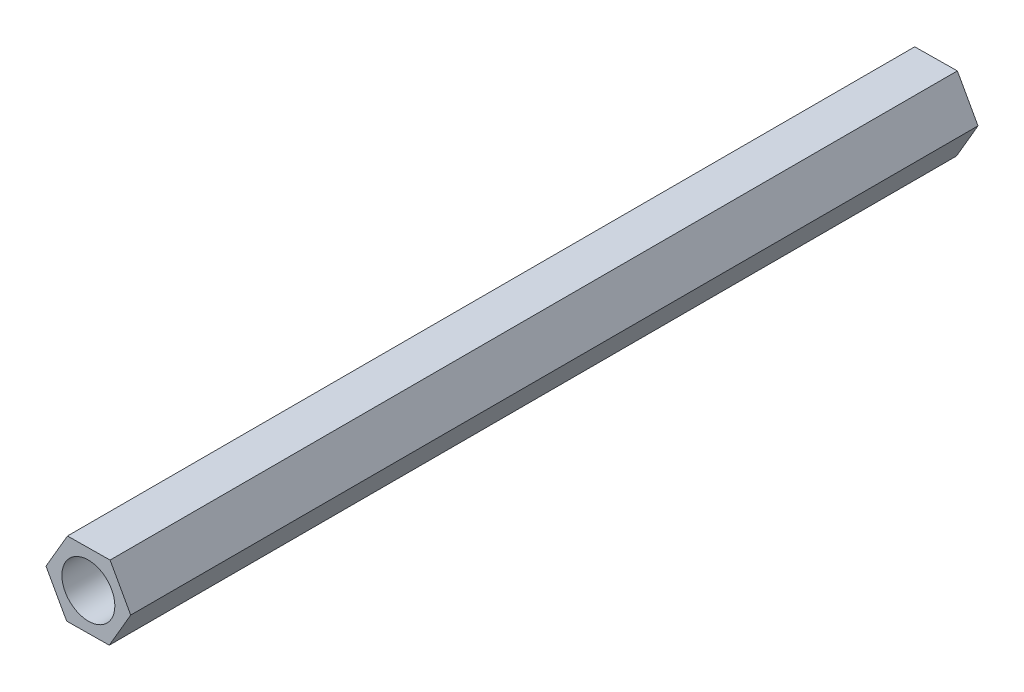
ISO-10303-21;
HEADER;
FILE_DESCRIPTION(('STEP AP214'),'2;1');
FILE_NAME('part.step','',(''),(''),'','','');
FILE_SCHEMA(('AUTOMOTIVE_DESIGN { 1 0 10303 214 1 1 1 1 }'));
ENDSEC;
DATA;
#1=APPLICATION_CONTEXT('core data for automotive mechanical design processes');
#2=APPLICATION_PROTOCOL_DEFINITION('international standard','automotive_design',2000,#1);
#3=PRODUCT_CONTEXT('',#1,'mechanical');
#4=PRODUCT('Part','Part','',(#3));
#5=PRODUCT_RELATED_PRODUCT_CATEGORY('part','',(#4));
#6=PRODUCT_DEFINITION_FORMATION('','',#4);
#7=PRODUCT_DEFINITION_CONTEXT('part definition',#1,'design');
#8=PRODUCT_DEFINITION('design','',#6,#7);
#9=PRODUCT_DEFINITION_SHAPE('','',#8);
#10=(LENGTH_UNIT() NAMED_UNIT(*) SI_UNIT(.MILLI.,.METRE.));
#11=(NAMED_UNIT(*) PLANE_ANGLE_UNIT() SI_UNIT($,.RADIAN.));
#12=(NAMED_UNIT(*) SI_UNIT($,.STERADIAN.) SOLID_ANGLE_UNIT());
#13=UNCERTAINTY_MEASURE_WITH_UNIT(LENGTH_MEASURE(1.E-05),#10,'distance_accuracy_value','');
#14=(GEOMETRIC_REPRESENTATION_CONTEXT(3) GLOBAL_UNCERTAINTY_ASSIGNED_CONTEXT((#13)) GLOBAL_UNIT_ASSIGNED_CONTEXT((#10,
#11,#12)) REPRESENTATION_CONTEXT('',''));
#15=CARTESIAN_POINT('',(0.,0.,0.));
#16=DIRECTION('',(0.,0.,1.));
#17=DIRECTION('',(1.,0.,0.));
#18=AXIS2_PLACEMENT_3D('',#15,#16,#17);
#19=CARTESIAN_POINT('',(0.,0.,80.));
#20=DIRECTION('',(0.,0.,-1.));
#21=DIRECTION('',(-1.,0.,0.));
#22=AXIS2_PLACEMENT_3D('',#19,#20,#21);
#23=PLANE('',#22);
#24=DIRECTION('',(-0.503203464957321,-0.864167965649587,0.));
#25=VECTOR('',#24,1.);
#26=CARTESIAN_POINT('',(-4.,0.,80.));
#27=LINE('',#26,#25);
#28=CARTESIAN_POINT('',(-1.97429018283957,3.47881851695993,80.));
#29=VERTEX_POINT('',#28);
#30=CARTESIAN_POINT('',(-4.,0.,80.));
#31=VERTEX_POINT('',#30);
#32=EDGE_CURVE('E146',#29,#31,#27,.T.);
#33=ORIENTED_EDGE('',*,*,#32,.T.);
#34=DIRECTION('',(0.484122918275927,-0.875,0.));
#35=VECTOR('',#34,1.);
#36=CARTESIAN_POINT('',(-2.05110136046643,-3.52242425470125,80.));
#37=LINE('',#36,#35);
#38=CARTESIAN_POINT('',(-2.05110136046643,-3.52242425470125,80.));
#39=VERTEX_POINT('',#38);
#40=EDGE_CURVE('E94',#31,#39,#37,.T.);
#41=ORIENTED_EDGE('',*,*,#40,.T.);
#42=DIRECTION('',(0.999941331794937,0.0108320343504131,0.));
#43=VECTOR('',#42,1.);
#44=CARTESIAN_POINT('',(1.97429018283957,-3.47881851695993,80.));
#45=LINE('',#44,#43);
#46=CARTESIAN_POINT('',(1.97429018283957,-3.47881851695993,80.));
#47=VERTEX_POINT('',#46);
#48=EDGE_CURVE('E107',#39,#47,#45,.T.);
#49=ORIENTED_EDGE('',*,*,#48,.T.);
#50=DIRECTION('',(0.503203464957321,0.864167965649587,0.));
#51=VECTOR('',#50,1.);
#52=CARTESIAN_POINT('',(4.,0.,80.));
#53=LINE('',#52,#51);
#54=CARTESIAN_POINT('',(4.,0.,80.));
#55=VERTEX_POINT('',#54);
#56=EDGE_CURVE('E101',#47,#55,#53,.T.);
#57=ORIENTED_EDGE('',*,*,#56,.T.);
#58=DIRECTION('',(-0.484122918275927,0.875,0.));
#59=VECTOR('',#58,1.);
#60=CARTESIAN_POINT('',(2.05110136046643,3.52242425470125,80.));
#61=LINE('',#60,#59);
#62=CARTESIAN_POINT('',(2.05110136046643,3.52242425470125,80.));
#63=VERTEX_POINT('',#62);
#64=EDGE_CURVE('E105',#55,#63,#61,.T.);
#65=ORIENTED_EDGE('',*,*,#64,.T.);
#66=DIRECTION('',(-0.999941331794937,-0.0108320343504131,0.));
#67=VECTOR('',#66,1.);
#68=CARTESIAN_POINT('',(-1.97429018283957,3.47881851695993,80.));
#69=LINE('',#68,#67);
#70=EDGE_CURVE('E57',#63,#29,#69,.T.);
#71=ORIENTED_EDGE('',*,*,#70,.T.);
#72=EDGE_LOOP('',(#33,#41,#49,#57,#65,#71));
#73=FACE_BOUND('',#72,.T.);
#74=CARTESIAN_POINT('',(0.,0.,80.));
#75=DIRECTION('',(0.,0.,1.));
#76=DIRECTION('',(1.,0.,0.));
#77=AXIS2_PLACEMENT_3D('',#74,#75,#76);
#78=CIRCLE('',#77,2.5);
#79=CARTESIAN_POINT('',(2.5,0.,80.));
#80=VERTEX_POINT('',#79);
#81=EDGE_CURVE('E134',#80,#80,#78,.T.);
#82=ORIENTED_EDGE('',*,*,#81,.F.);
#83=EDGE_LOOP('',(#82));
#84=FACE_BOUND('',#83,.T.);
#85=ADVANCED_FACE('F39',(#73,#84),#23,.F.);
#86=CARTESIAN_POINT('',(0.,0.,0.));
#87=DIRECTION('',(0.,0.,-1.));
#88=DIRECTION('',(-1.,0.,0.));
#89=AXIS2_PLACEMENT_3D('',#86,#87,#88);
#90=PLANE('',#89);
#91=DIRECTION('',(-0.503203464957321,-0.864167965649587,0.));
#92=VECTOR('',#91,1.);
#93=CARTESIAN_POINT('',(-4.,0.,0.));
#94=LINE('',#93,#92);
#95=CARTESIAN_POINT('',(-1.97429018283957,3.47881851695993,0.));
#96=VERTEX_POINT('',#95);
#97=CARTESIAN_POINT('',(-4.,0.,0.));
#98=VERTEX_POINT('',#97);
#99=EDGE_CURVE('E129',#96,#98,#94,.T.);
#100=ORIENTED_EDGE('',*,*,#99,.F.);
#101=DIRECTION('',(-0.999941331794937,-0.0108320343504131,0.));
#102=VECTOR('',#101,1.);
#103=CARTESIAN_POINT('',(-1.97429018283957,3.47881851695993,0.));
#104=LINE('',#103,#102);
#105=CARTESIAN_POINT('',(2.05110136046643,3.52242425470125,0.));
#106=VERTEX_POINT('',#105);
#107=EDGE_CURVE('E86',#106,#96,#104,.T.);
#108=ORIENTED_EDGE('',*,*,#107,.F.);
#109=DIRECTION('',(-0.484122918275927,0.875,0.));
#110=VECTOR('',#109,1.);
#111=CARTESIAN_POINT('',(2.05110136046643,3.52242425470125,0.));
#112=LINE('',#111,#110);
#113=CARTESIAN_POINT('',(4.,0.,0.));
#114=VERTEX_POINT('',#113);
#115=EDGE_CURVE('E80',#114,#106,#112,.T.);
#116=ORIENTED_EDGE('',*,*,#115,.F.);
#117=DIRECTION('',(0.503203464957321,0.864167965649587,0.));
#118=VECTOR('',#117,1.);
#119=CARTESIAN_POINT('',(4.,0.,0.));
#120=LINE('',#119,#118);
#121=CARTESIAN_POINT('',(1.97429018283957,-3.47881851695993,0.));
#122=VERTEX_POINT('',#121);
#123=EDGE_CURVE('E116',#122,#114,#120,.T.);
#124=ORIENTED_EDGE('',*,*,#123,.F.);
#125=DIRECTION('',(0.999941331794937,0.0108320343504131,0.));
#126=VECTOR('',#125,1.);
#127=CARTESIAN_POINT('',(1.97429018283957,-3.47881851695993,0.));
#128=LINE('',#127,#126);
#129=CARTESIAN_POINT('',(-2.05110136046643,-3.52242425470125,0.));
#130=VERTEX_POINT('',#129);
#131=EDGE_CURVE('E137',#130,#122,#128,.T.);
#132=ORIENTED_EDGE('',*,*,#131,.F.);
#133=DIRECTION('',(0.484122918275927,-0.875,0.));
#134=VECTOR('',#133,1.);
#135=CARTESIAN_POINT('',(-2.05110136046643,-3.52242425470125,0.));
#136=LINE('',#135,#134);
#137=EDGE_CURVE('E133',#98,#130,#136,.T.);
#138=ORIENTED_EDGE('',*,*,#137,.F.);
#139=EDGE_LOOP('',(#100,#108,#116,#124,#132,#138));
#140=FACE_BOUND('',#139,.T.);
#141=CARTESIAN_POINT('',(0.,0.,0.));
#142=DIRECTION('',(0.,0.,1.));
#143=DIRECTION('',(1.,0.,0.));
#144=AXIS2_PLACEMENT_3D('',#141,#142,#143);
#145=CIRCLE('',#144,2.5);
#146=CARTESIAN_POINT('',(2.5,0.,0.));
#147=VERTEX_POINT('',#146);
#148=EDGE_CURVE('E243',#147,#147,#145,.T.);
#149=ORIENTED_EDGE('',*,*,#148,.T.);
#150=EDGE_LOOP('',(#149));
#151=FACE_BOUND('',#150,.T.);
#152=ADVANCED_FACE('F159',(#140,#151),#90,.T.);
#153=CARTESIAN_POINT('',(-4.,0.,80.));
#154=DIRECTION('',(0.864167965649587,-0.503203464957321,0.));
#155=DIRECTION('',(0.503203464957321,0.864167965649587,0.));
#156=AXIS2_PLACEMENT_3D('',#153,#154,#155);
#157=PLANE('',#156);
#158=ORIENTED_EDGE('',*,*,#99,.T.);
#159=DIRECTION('',(0.,0.,-1.));
#160=VECTOR('',#159,1.);
#161=CARTESIAN_POINT('',(-4.,0.,80.));
#162=LINE('',#161,#160);
#163=EDGE_CURVE('E11',#31,#98,#162,.T.);
#164=ORIENTED_EDGE('',*,*,#163,.F.);
#165=ORIENTED_EDGE('',*,*,#32,.F.);
#166=DIRECTION('',(0.,0.,-1.));
#167=VECTOR('',#166,1.);
#168=CARTESIAN_POINT('',(-1.97429018283957,3.47881851695993,80.));
#169=LINE('',#168,#167);
#170=EDGE_CURVE('E125',#29,#96,#169,.T.);
#171=ORIENTED_EDGE('',*,*,#170,.T.);
#172=EDGE_LOOP('',(#158,#164,#165,#171));
#173=FACE_BOUND('',#172,.T.);
#174=ADVANCED_FACE('F41',(#173),#157,.F.);
#175=CARTESIAN_POINT('',(-2.05110136046643,-3.52242425470125,80.));
#176=DIRECTION('',(0.875,0.484122918275927,0.));
#177=DIRECTION('',(-0.484122918275927,0.875,0.));
#178=AXIS2_PLACEMENT_3D('',#175,#176,#177);
#179=PLANE('',#178);
#180=ORIENTED_EDGE('',*,*,#137,.T.);
#181=DIRECTION('',(0.,0.,-1.));
#182=VECTOR('',#181,1.);
#183=CARTESIAN_POINT('',(-2.05110136046643,-3.52242425470125,80.));
#184=LINE('',#183,#182);
#185=EDGE_CURVE('E49',#39,#130,#184,.T.);
#186=ORIENTED_EDGE('',*,*,#185,.F.);
#187=ORIENTED_EDGE('',*,*,#40,.F.);
#188=ORIENTED_EDGE('',*,*,#163,.T.);
#189=EDGE_LOOP('',(#180,#186,#187,#188));
#190=FACE_BOUND('',#189,.T.);
#191=ADVANCED_FACE('F184',(#190),#179,.F.);
#192=CARTESIAN_POINT('',(1.97429018283957,-3.47881851695993,80.));
#193=DIRECTION('',(-0.0108320343504131,0.999941331794937,0.));
#194=DIRECTION('',(-0.999941331794937,-0.0108320343504131,0.));
#195=AXIS2_PLACEMENT_3D('',#192,#193,#194);
#196=PLANE('',#195);
#197=ORIENTED_EDGE('',*,*,#131,.T.);
#198=DIRECTION('',(0.,0.,-1.));
#199=VECTOR('',#198,1.);
#200=CARTESIAN_POINT('',(1.97429018283957,-3.47881851695993,80.));
#201=LINE('',#200,#199);
#202=EDGE_CURVE('E118',#47,#122,#201,.T.);
#203=ORIENTED_EDGE('',*,*,#202,.F.);
#204=ORIENTED_EDGE('',*,*,#48,.F.);
#205=ORIENTED_EDGE('',*,*,#185,.T.);
#206=EDGE_LOOP('',(#197,#203,#204,#205));
#207=FACE_BOUND('',#206,.T.);
#208=ADVANCED_FACE('F156',(#207),#196,.F.);
#209=CARTESIAN_POINT('',(4.,0.,80.));
#210=DIRECTION('',(-0.864167965649587,0.503203464957321,0.));
#211=DIRECTION('',(-0.503203464957321,-0.864167965649587,0.));
#212=AXIS2_PLACEMENT_3D('',#209,#210,#211);
#213=PLANE('',#212);
#214=ORIENTED_EDGE('',*,*,#123,.T.);
#215=DIRECTION('',(0.,0.,-1.));
#216=VECTOR('',#215,1.);
#217=CARTESIAN_POINT('',(4.,0.,80.));
#218=LINE('',#217,#216);
#219=EDGE_CURVE('E113',#55,#114,#218,.T.);
#220=ORIENTED_EDGE('',*,*,#219,.F.);
#221=ORIENTED_EDGE('',*,*,#56,.F.);
#222=ORIENTED_EDGE('',*,*,#202,.T.);
#223=EDGE_LOOP('',(#214,#220,#221,#222));
#224=FACE_BOUND('',#223,.T.);
#225=ADVANCED_FACE('F114',(#224),#213,.F.);
#226=CARTESIAN_POINT('',(2.05110136046643,3.52242425470125,80.));
#227=DIRECTION('',(-0.875,-0.484122918275927,0.));
#228=DIRECTION('',(0.484122918275927,-0.875,0.));
#229=AXIS2_PLACEMENT_3D('',#226,#227,#228);
#230=PLANE('',#229);
#231=ORIENTED_EDGE('',*,*,#115,.T.);
#232=DIRECTION('',(0.,0.,-1.));
#233=VECTOR('',#232,1.);
#234=CARTESIAN_POINT('',(2.05110136046643,3.52242425470125,80.));
#235=LINE('',#234,#233);
#236=EDGE_CURVE('E119',#63,#106,#235,.T.);
#237=ORIENTED_EDGE('',*,*,#236,.F.);
#238=ORIENTED_EDGE('',*,*,#64,.F.);
#239=ORIENTED_EDGE('',*,*,#219,.T.);
#240=EDGE_LOOP('',(#231,#237,#238,#239));
#241=FACE_BOUND('',#240,.T.);
#242=ADVANCED_FACE('F121',(#241),#230,.F.);
#243=CARTESIAN_POINT('',(-1.97429018283957,3.47881851695993,80.));
#244=DIRECTION('',(0.0108320343504131,-0.999941331794937,0.));
#245=DIRECTION('',(0.999941331794937,0.0108320343504131,0.));
#246=AXIS2_PLACEMENT_3D('',#243,#244,#245);
#247=PLANE('',#246);
#248=ORIENTED_EDGE('',*,*,#107,.T.);
#249=ORIENTED_EDGE('',*,*,#170,.F.);
#250=ORIENTED_EDGE('',*,*,#70,.F.);
#251=ORIENTED_EDGE('',*,*,#236,.T.);
#252=EDGE_LOOP('',(#248,#249,#250,#251));
#253=FACE_BOUND('',#252,.T.);
#254=ADVANCED_FACE('F164',(#253),#247,.F.);
#255=CARTESIAN_POINT('',(0.,0.,80.));
#256=DIRECTION('',(0.,0.,-1.));
#257=DIRECTION('',(-1.,0.,0.));
#258=AXIS2_PLACEMENT_3D('',#255,#256,#257);
#259=CYLINDRICAL_SURFACE('',#258,2.5);
#260=ORIENTED_EDGE('',*,*,#81,.T.);
#261=EDGE_LOOP('',(#260));
#262=FACE_BOUND('',#261,.T.);
#263=ORIENTED_EDGE('',*,*,#148,.F.);
#264=EDGE_LOOP('',(#263));
#265=FACE_BOUND('',#264,.T.);
#266=ADVANCED_FACE('F166',(#262,#265),#259,.F.);
#267=CLOSED_SHELL('',(#85,#152,#174,#191,#208,#225,#242,#254,#266));
#268=MANIFOLD_SOLID_BREP('B2',#267);
#269=ADVANCED_BREP_SHAPE_REPRESENTATION('',(#18,#268),#14);
#270=SHAPE_DEFINITION_REPRESENTATION(#9,#269);
ENDSEC;
END-ISO-10303-21;
